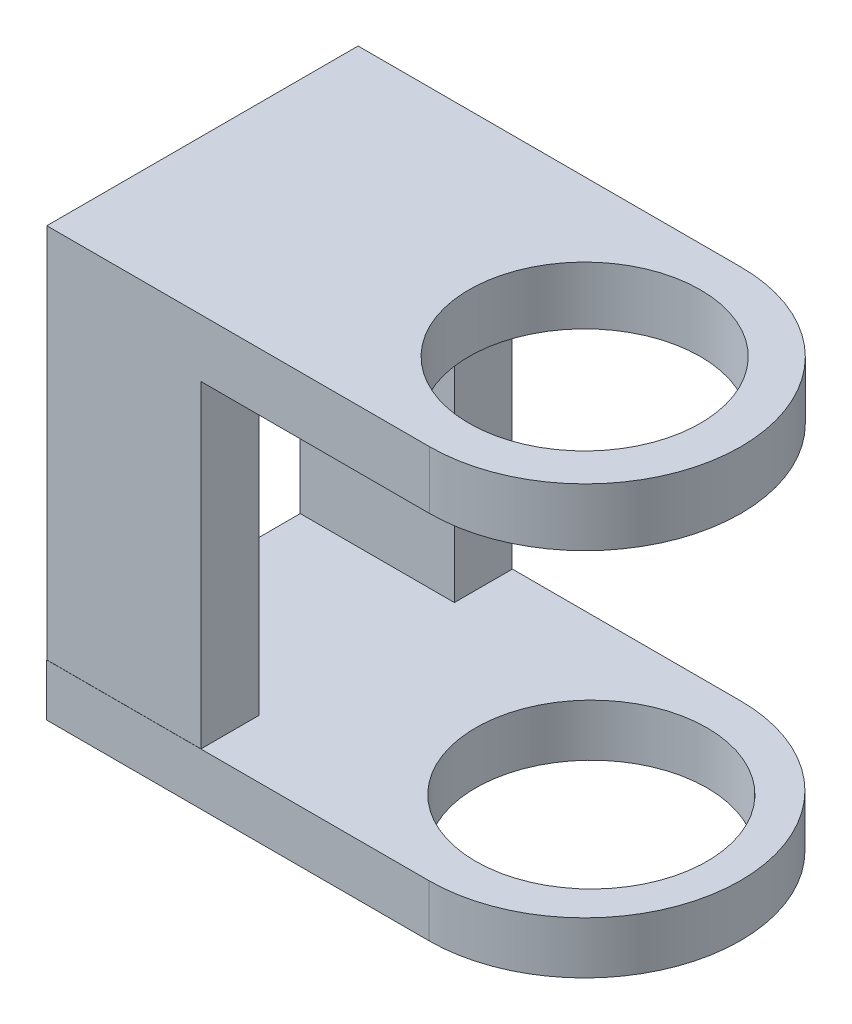
ISO-10303-21;
HEADER;
FILE_DESCRIPTION(('STEP AP214'),'2;1');
FILE_NAME('part.step','',(''),(''),'','','');
FILE_SCHEMA(('AUTOMOTIVE_DESIGN { 1 0 10303 214 1 1 1 1 }'));
ENDSEC;
DATA;
#1=APPLICATION_CONTEXT('core data for automotive mechanical design processes');
#2=APPLICATION_PROTOCOL_DEFINITION('international standard','automotive_design',2000,#1);
#3=PRODUCT_CONTEXT('',#1,'mechanical');
#4=PRODUCT('Part','Part','',(#3));
#5=PRODUCT_RELATED_PRODUCT_CATEGORY('part','',(#4));
#6=PRODUCT_DEFINITION_FORMATION('','',#4);
#7=PRODUCT_DEFINITION_CONTEXT('part definition',#1,'design');
#8=PRODUCT_DEFINITION('design','',#6,#7);
#9=PRODUCT_DEFINITION_SHAPE('','',#8);
#10=(LENGTH_UNIT() NAMED_UNIT(*) SI_UNIT(.MILLI.,.METRE.));
#11=(NAMED_UNIT(*) PLANE_ANGLE_UNIT() SI_UNIT($,.RADIAN.));
#12=(NAMED_UNIT(*) SI_UNIT($,.STERADIAN.) SOLID_ANGLE_UNIT());
#13=UNCERTAINTY_MEASURE_WITH_UNIT(LENGTH_MEASURE(1.E-05),#10,'distance_accuracy_value','');
#14=(GEOMETRIC_REPRESENTATION_CONTEXT(3) GLOBAL_UNCERTAINTY_ASSIGNED_CONTEXT((#13)) GLOBAL_UNIT_ASSIGNED_CONTEXT((#10,
#11,#12)) REPRESENTATION_CONTEXT('',''));
#15=CARTESIAN_POINT('',(0.,0.,0.));
#16=DIRECTION('',(0.,0.,1.));
#17=DIRECTION('',(1.,0.,0.));
#18=AXIS2_PLACEMENT_3D('',#15,#16,#17);
#19=CARTESIAN_POINT('',(0.,0.,0.));
#20=DIRECTION('',(0.,1.,0.));
#21=DIRECTION('',(0.,0.,1.));
#22=AXIS2_PLACEMENT_3D('',#19,#20,#21);
#23=PLANE('',#22);
#24=CARTESIAN_POINT('',(127.980340475688,0.,0.));
#25=DIRECTION('',(0.,1.,0.));
#26=DIRECTION('',(0.,0.,1.));
#27=AXIS2_PLACEMENT_3D('',#24,#25,#26);
#28=CIRCLE('',#27,20.);
#29=CARTESIAN_POINT('',(127.980340475688,0.,20.));
#30=VERTEX_POINT('',#29);
#31=EDGE_CURVE('E218',#30,#30,#28,.T.);
#32=ORIENTED_EDGE('',*,*,#31,.T.);
#33=EDGE_LOOP('',(#32));
#34=FACE_BOUND('',#33,.T.);
#35=DIRECTION('',(1.,0.,0.));
#36=VECTOR('',#35,1.);
#37=CARTESIAN_POINT('',(28.558456052823,0.,16.9042760508236));
#38=LINE('',#37,#36);
#39=CARTESIAN_POINT('',(61.9095747911587,0.,16.9042760508236));
#40=VERTEX_POINT('',#39);
#41=CARTESIAN_POINT('',(88.558456052823,0.,16.9042760508236));
#42=VERTEX_POINT('',#41);
#43=EDGE_CURVE('E185',#40,#42,#38,.T.);
#44=ORIENTED_EDGE('',*,*,#43,.F.);
#45=DIRECTION('',(0.,0.,-1.));
#46=VECTOR('',#45,1.);
#47=CARTESIAN_POINT('',(61.9095747911587,0.,0.));
#48=LINE('',#47,#46);
#49=CARTESIAN_POINT('',(61.9095747911587,0.,-16.9042760508236));
#50=VERTEX_POINT('',#49);
#51=EDGE_CURVE('E276',#40,#50,#48,.T.);
#52=ORIENTED_EDGE('',*,*,#51,.T.);
#53=DIRECTION('',(-1.,0.,0.));
#54=VECTOR('',#53,1.);
#55=CARTESIAN_POINT('',(28.558456052823,0.,-16.9042760508236));
#56=LINE('',#55,#54);
#57=CARTESIAN_POINT('',(88.558456052823,0.,-16.9042760508236));
#58=VERTEX_POINT('',#57);
#59=EDGE_CURVE('E171',#58,#50,#56,.T.);
#60=ORIENTED_EDGE('',*,*,#59,.F.);
#61=DIRECTION('',(0.,0.,1.));
#62=VECTOR('',#61,1.);
#63=CARTESIAN_POINT('',(88.558456052823,0.,-26.9042760508236));
#64=LINE('',#63,#62);
#65=CARTESIAN_POINT('',(88.558456052823,0.,-26.9042760508236));
#66=VERTEX_POINT('',#65);
#67=EDGE_CURVE('E167',#66,#58,#64,.T.);
#68=ORIENTED_EDGE('',*,*,#67,.F.);
#69=DIRECTION('',(-1.,0.,0.));
#70=VECTOR('',#69,1.);
#71=CARTESIAN_POINT('',(0.,0.,-26.9042760508236));
#72=LINE('',#71,#70);
#73=CARTESIAN_POINT('',(128.07951134054,0.,-26.9042760508236));
#74=VERTEX_POINT('',#73);
#75=EDGE_CURVE('E227',#74,#66,#72,.T.);
#76=ORIENTED_EDGE('',*,*,#75,.F.);
#77=CARTESIAN_POINT('',(128.07951134054,0.,0.));
#78=DIRECTION('',(0.,1.,0.));
#79=DIRECTION('',(0.,0.,1.));
#80=AXIS2_PLACEMENT_3D('',#77,#78,#79);
#81=CIRCLE('',#80,26.9042760508236);
#82=CARTESIAN_POINT('',(128.07951134054,0.,26.9042760508236));
#83=VERTEX_POINT('',#82);
#84=EDGE_CURVE('E234',#83,#74,#81,.T.);
#85=ORIENTED_EDGE('',*,*,#84,.F.);
#86=DIRECTION('',(1.,0.,0.));
#87=VECTOR('',#86,1.);
#88=CARTESIAN_POINT('',(0.,0.,26.9042760508236));
#89=LINE('',#88,#87);
#90=CARTESIAN_POINT('',(88.558456052823,0.,26.9042760508236));
#91=VERTEX_POINT('',#90);
#92=EDGE_CURVE('E205',#91,#83,#89,.T.);
#93=ORIENTED_EDGE('',*,*,#92,.F.);
#94=DIRECTION('',(0.,0.,1.));
#95=VECTOR('',#94,1.);
#96=CARTESIAN_POINT('',(88.558456052823,0.,26.9042760508236));
#97=LINE('',#96,#95);
#98=EDGE_CURVE('E189',#42,#91,#97,.T.);
#99=ORIENTED_EDGE('',*,*,#98,.F.);
#100=EDGE_LOOP('',(#44,#52,#60,#68,#76,#85,#93,#99));
#101=FACE_BOUND('',#100,.T.);
#102=ADVANCED_FACE('F33',(#34,#101),#23,.F.);
#103=CARTESIAN_POINT('',(0.,10.,26.9042760508236));
#104=DIRECTION('',(0.,0.,-1.));
#105=DIRECTION('',(-1.,0.,0.));
#106=AXIS2_PLACEMENT_3D('',#103,#104,#105);
#107=PLANE('',#106);
#108=DIRECTION('',(1.,0.,0.));
#109=VECTOR('',#108,1.);
#110=CARTESIAN_POINT('',(0.,10.,26.9042760508236));
#111=LINE('',#110,#109);
#112=CARTESIAN_POINT('',(61.9095747911587,10.,26.9042760508236));
#113=VERTEX_POINT('',#112);
#114=CARTESIAN_POINT('',(128.07951134054,10.,26.9042760508236));
#115=VERTEX_POINT('',#114);
#116=EDGE_CURVE('E224',#113,#115,#111,.T.);
#117=ORIENTED_EDGE('',*,*,#116,.F.);
#118=DIRECTION('',(0.,-1.,0.));
#119=VECTOR('',#118,1.);
#120=CARTESIAN_POINT('',(61.9095747911587,10.,26.9042760508236));
#121=LINE('',#120,#119);
#122=CARTESIAN_POINT('',(61.9095747911587,-55.,26.9042760508236));
#123=VERTEX_POINT('',#122);
#124=EDGE_CURVE('E267',#113,#123,#121,.T.);
#125=ORIENTED_EDGE('',*,*,#124,.T.);
#126=DIRECTION('',(-1.,0.,0.));
#127=VECTOR('',#126,1.);
#128=CARTESIAN_POINT('',(28.558456052823,-55.,26.9042760508236));
#129=LINE('',#128,#127);
#130=CARTESIAN_POINT('',(88.558456052823,-55.,26.9042760508236));
#131=VERTEX_POINT('',#130);
#132=EDGE_CURVE('E192',#131,#123,#129,.T.);
#133=ORIENTED_EDGE('',*,*,#132,.F.);
#134=DIRECTION('',(0.,1.,0.));
#135=VECTOR('',#134,1.);
#136=CARTESIAN_POINT('',(88.558456052823,-55.,26.9042760508236));
#137=LINE('',#136,#135);
#138=EDGE_CURVE('E195',#131,#91,#137,.T.);
#139=ORIENTED_EDGE('',*,*,#138,.T.);
#140=ORIENTED_EDGE('',*,*,#92,.T.);
#141=DIRECTION('',(0.,-1.,0.));
#142=VECTOR('',#141,1.);
#143=CARTESIAN_POINT('',(128.07951134054,10.,26.9042760508236));
#144=LINE('',#143,#142);
#145=EDGE_CURVE('E41',#115,#83,#144,.T.);
#146=ORIENTED_EDGE('',*,*,#145,.F.);
#147=EDGE_LOOP('',(#117,#125,#133,#139,#140,#146));
#148=FACE_BOUND('',#147,.T.);
#149=ADVANCED_FACE('F35',(#148),#107,.F.);
#150=CARTESIAN_POINT('',(128.07951134054,10.,0.));
#151=DIRECTION('',(0.,-1.,0.));
#152=DIRECTION('',(0.,0.,-1.));
#153=AXIS2_PLACEMENT_3D('',#150,#151,#152);
#154=CYLINDRICAL_SURFACE('',#153,26.9042760508236);
#155=ORIENTED_EDGE('',*,*,#84,.T.);
#156=DIRECTION('',(0.,-1.,0.));
#157=VECTOR('',#156,1.);
#158=CARTESIAN_POINT('',(128.07951134054,10.,-26.9042760508236));
#159=LINE('',#158,#157);
#160=CARTESIAN_POINT('',(128.07951134054,10.,-26.9042760508236));
#161=VERTEX_POINT('',#160);
#162=EDGE_CURVE('E231',#161,#74,#159,.T.);
#163=ORIENTED_EDGE('',*,*,#162,.F.);
#164=CARTESIAN_POINT('',(128.07951134054,10.,0.));
#165=DIRECTION('',(0.,1.,0.));
#166=DIRECTION('',(0.,0.,1.));
#167=AXIS2_PLACEMENT_3D('',#164,#165,#166);
#168=CIRCLE('',#167,26.9042760508236);
#169=EDGE_CURVE('E226',#115,#161,#168,.T.);
#170=ORIENTED_EDGE('',*,*,#169,.F.);
#171=ORIENTED_EDGE('',*,*,#145,.T.);
#172=EDGE_LOOP('',(#155,#163,#170,#171));
#173=FACE_BOUND('',#172,.T.);
#174=ADVANCED_FACE('F244',(#173),#154,.T.);
#175=CARTESIAN_POINT('',(0.,10.,-26.9042760508236));
#176=DIRECTION('',(0.,0.,1.));
#177=DIRECTION('',(1.,0.,0.));
#178=AXIS2_PLACEMENT_3D('',#175,#176,#177);
#179=PLANE('',#178);
#180=DIRECTION('',(1.,0.,0.));
#181=VECTOR('',#180,1.);
#182=CARTESIAN_POINT('',(28.558456052823,-55.,-26.9042760508236));
#183=LINE('',#182,#181);
#184=CARTESIAN_POINT('',(61.9095747911587,-55.,-26.9042760508236));
#185=VERTEX_POINT('',#184);
#186=CARTESIAN_POINT('',(88.558456052823,-55.,-26.9042760508236));
#187=VERTEX_POINT('',#186);
#188=EDGE_CURVE('E168',#185,#187,#183,.T.);
#189=ORIENTED_EDGE('',*,*,#188,.F.);
#190=DIRECTION('',(0.,1.,0.));
#191=VECTOR('',#190,1.);
#192=CARTESIAN_POINT('',(61.9095747911587,10.,-26.9042760508236));
#193=LINE('',#192,#191);
#194=CARTESIAN_POINT('',(61.9095747911587,10.,-26.9042760508236));
#195=VERTEX_POINT('',#194);
#196=EDGE_CURVE('E260',#185,#195,#193,.T.);
#197=ORIENTED_EDGE('',*,*,#196,.T.);
#198=DIRECTION('',(-1.,0.,0.));
#199=VECTOR('',#198,1.);
#200=CARTESIAN_POINT('',(0.,10.,-26.9042760508236));
#201=LINE('',#200,#199);
#202=EDGE_CURVE('E229',#161,#195,#201,.T.);
#203=ORIENTED_EDGE('',*,*,#202,.F.);
#204=ORIENTED_EDGE('',*,*,#162,.T.);
#205=ORIENTED_EDGE('',*,*,#75,.T.);
#206=DIRECTION('',(0.,1.,0.));
#207=VECTOR('',#206,1.);
#208=CARTESIAN_POINT('',(88.558456052823,-55.,-26.9042760508236));
#209=LINE('',#208,#207);
#210=EDGE_CURVE('E183',#187,#66,#209,.T.);
#211=ORIENTED_EDGE('',*,*,#210,.F.);
#212=EDGE_LOOP('',(#189,#197,#203,#204,#205,#211));
#213=FACE_BOUND('',#212,.T.);
#214=ADVANCED_FACE('F256',(#213),#179,.F.);
#215=CARTESIAN_POINT('',(0.,10.,0.));
#216=DIRECTION('',(0.,1.,0.));
#217=DIRECTION('',(0.,0.,1.));
#218=AXIS2_PLACEMENT_3D('',#215,#216,#217);
#219=PLANE('',#218);
#220=DIRECTION('',(0.,0.,-1.));
#221=VECTOR('',#220,1.);
#222=CARTESIAN_POINT('',(61.9095747911587,10.,0.));
#223=LINE('',#222,#221);
#224=EDGE_CURVE('E265',#113,#195,#223,.T.);
#225=ORIENTED_EDGE('',*,*,#224,.F.);
#226=ORIENTED_EDGE('',*,*,#116,.T.);
#227=ORIENTED_EDGE('',*,*,#169,.T.);
#228=ORIENTED_EDGE('',*,*,#202,.T.);
#229=EDGE_LOOP('',(#225,#226,#227,#228));
#230=FACE_BOUND('',#229,.T.);
#231=CARTESIAN_POINT('',(127.980340475688,10.,0.));
#232=DIRECTION('',(0.,1.,0.));
#233=DIRECTION('',(0.,0.,1.));
#234=AXIS2_PLACEMENT_3D('',#231,#232,#233);
#235=CIRCLE('',#234,20.);
#236=CARTESIAN_POINT('',(127.980340475688,10.,20.));
#237=VERTEX_POINT('',#236);
#238=EDGE_CURVE('E213',#237,#237,#235,.T.);
#239=ORIENTED_EDGE('',*,*,#238,.F.);
#240=EDGE_LOOP('',(#239));
#241=FACE_BOUND('',#240,.T.);
#242=ADVANCED_FACE('F263',(#230,#241),#219,.T.);
#243=CARTESIAN_POINT('',(127.980340475688,0.,0.));
#244=DIRECTION('',(0.,1.,0.));
#245=DIRECTION('',(0.,0.,1.));
#246=AXIS2_PLACEMENT_3D('',#243,#244,#245);
#247=CYLINDRICAL_SURFACE('',#246,20.);
#248=ORIENTED_EDGE('',*,*,#31,.F.);
#249=EDGE_LOOP('',(#248));
#250=FACE_BOUND('',#249,.T.);
#251=ORIENTED_EDGE('',*,*,#238,.T.);
#252=EDGE_LOOP('',(#251));
#253=FACE_BOUND('',#252,.T.);
#254=ADVANCED_FACE('F340',(#250,#253),#247,.F.);
#255=CARTESIAN_POINT('',(28.558456052823,-55.,16.9042760508236));
#256=DIRECTION('',(0.,0.,1.));
#257=DIRECTION('',(1.,0.,0.));
#258=AXIS2_PLACEMENT_3D('',#255,#256,#257);
#259=PLANE('',#258);
#260=DIRECTION('',(1.,0.,0.));
#261=VECTOR('',#260,1.);
#262=CARTESIAN_POINT('',(28.558456052823,-55.,16.9042760508236));
#263=LINE('',#262,#261);
#264=CARTESIAN_POINT('',(61.9095747911587,-55.,16.9042760508236));
#265=VERTEX_POINT('',#264);
#266=CARTESIAN_POINT('',(88.558456052823,-55.,16.9042760508236));
#267=VERTEX_POINT('',#266);
#268=EDGE_CURVE('E186',#265,#267,#263,.T.);
#269=ORIENTED_EDGE('',*,*,#268,.F.);
#270=DIRECTION('',(0.,1.,0.));
#271=VECTOR('',#270,1.);
#272=CARTESIAN_POINT('',(61.9095747911587,-55.,16.9042760508236));
#273=LINE('',#272,#271);
#274=EDGE_CURVE('E48',#265,#40,#273,.T.);
#275=ORIENTED_EDGE('',*,*,#274,.T.);
#276=ORIENTED_EDGE('',*,*,#43,.T.);
#277=DIRECTION('',(0.,1.,0.));
#278=VECTOR('',#277,1.);
#279=CARTESIAN_POINT('',(88.558456052823,-55.,16.9042760508236));
#280=LINE('',#279,#278);
#281=EDGE_CURVE('E199',#267,#42,#280,.T.);
#282=ORIENTED_EDGE('',*,*,#281,.F.);
#283=EDGE_LOOP('',(#269,#275,#276,#282));
#284=FACE_BOUND('',#283,.T.);
#285=ADVANCED_FACE('F278',(#284),#259,.F.);
#286=CARTESIAN_POINT('',(88.558456052823,-55.,26.9042760508236));
#287=DIRECTION('',(-1.,0.,0.));
#288=DIRECTION('',(0.,0.,1.));
#289=AXIS2_PLACEMENT_3D('',#286,#287,#288);
#290=PLANE('',#289);
#291=ORIENTED_EDGE('',*,*,#98,.T.);
#292=ORIENTED_EDGE('',*,*,#138,.F.);
#293=DIRECTION('',(0.,0.,1.));
#294=VECTOR('',#293,1.);
#295=CARTESIAN_POINT('',(88.558456052823,-55.,26.9042760508236));
#296=LINE('',#295,#294);
#297=EDGE_CURVE('E188',#267,#131,#296,.T.);
#298=ORIENTED_EDGE('',*,*,#297,.F.);
#299=ORIENTED_EDGE('',*,*,#281,.T.);
#300=EDGE_LOOP('',(#291,#292,#298,#299));
#301=FACE_BOUND('',#300,.T.);
#302=ADVANCED_FACE('F274',(#301),#290,.F.);
#303=CARTESIAN_POINT('',(88.558456052823,-55.,-26.9042760508236));
#304=DIRECTION('',(-1.,0.,0.));
#305=DIRECTION('',(0.,0.,1.));
#306=AXIS2_PLACEMENT_3D('',#303,#304,#305);
#307=PLANE('',#306);
#308=ORIENTED_EDGE('',*,*,#67,.T.);
#309=DIRECTION('',(0.,1.,0.));
#310=VECTOR('',#309,1.);
#311=CARTESIAN_POINT('',(88.558456052823,-55.,-16.9042760508236));
#312=LINE('',#311,#310);
#313=CARTESIAN_POINT('',(88.558456052823,-55.,-16.9042760508236));
#314=VERTEX_POINT('',#313);
#315=EDGE_CURVE('E177',#314,#58,#312,.T.);
#316=ORIENTED_EDGE('',*,*,#315,.F.);
#317=DIRECTION('',(0.,0.,1.));
#318=VECTOR('',#317,1.);
#319=CARTESIAN_POINT('',(88.558456052823,-55.,-26.9042760508236));
#320=LINE('',#319,#318);
#321=EDGE_CURVE('E170',#187,#314,#320,.T.);
#322=ORIENTED_EDGE('',*,*,#321,.F.);
#323=ORIENTED_EDGE('',*,*,#210,.T.);
#324=EDGE_LOOP('',(#308,#316,#322,#323));
#325=FACE_BOUND('',#324,.T.);
#326=ADVANCED_FACE('F305',(#325),#307,.F.);
#327=CARTESIAN_POINT('',(28.558456052823,-55.,-16.9042760508236));
#328=DIRECTION('',(0.,0.,-1.));
#329=DIRECTION('',(-1.,0.,0.));
#330=AXIS2_PLACEMENT_3D('',#327,#328,#329);
#331=PLANE('',#330);
#332=ORIENTED_EDGE('',*,*,#59,.T.);
#333=DIRECTION('',(0.,-1.,0.));
#334=VECTOR('',#333,1.);
#335=CARTESIAN_POINT('',(61.9095747911587,-55.,-16.9042760508236));
#336=LINE('',#335,#334);
#337=CARTESIAN_POINT('',(61.9095747911587,-55.,-16.9042760508236));
#338=VERTEX_POINT('',#337);
#339=EDGE_CURVE('E279',#50,#338,#336,.T.);
#340=ORIENTED_EDGE('',*,*,#339,.T.);
#341=DIRECTION('',(-1.,0.,0.));
#342=VECTOR('',#341,1.);
#343=CARTESIAN_POINT('',(28.558456052823,-55.,-16.9042760508236));
#344=LINE('',#343,#342);
#345=EDGE_CURVE('E174',#314,#338,#344,.T.);
#346=ORIENTED_EDGE('',*,*,#345,.F.);
#347=ORIENTED_EDGE('',*,*,#315,.T.);
#348=EDGE_LOOP('',(#332,#340,#346,#347));
#349=FACE_BOUND('',#348,.T.);
#350=ADVANCED_FACE('F303',(#349),#331,.F.);
#351=CARTESIAN_POINT('',(0.,-55.,0.));
#352=DIRECTION('',(0.,-1.,0.));
#353=DIRECTION('',(0.,0.,-1.));
#354=AXIS2_PLACEMENT_3D('',#351,#352,#353);
#355=PLANE('',#354);
#356=CARTESIAN_POINT('',(129.13998933297,-55.,0.));
#357=DIRECTION('',(0.,-1.,0.));
#358=DIRECTION('',(0.,0.,-1.));
#359=AXIS2_PLACEMENT_3D('',#356,#357,#358);
#360=CIRCLE('',#359,20.);
#361=CARTESIAN_POINT('',(129.13998933297,-55.,-20.));
#362=VERTEX_POINT('',#361);
#363=EDGE_CURVE('E162',#362,#362,#360,.T.);
#364=ORIENTED_EDGE('',*,*,#363,.T.);
#365=EDGE_LOOP('',(#364));
#366=FACE_BOUND('',#365,.T.);
#367=DIRECTION('',(1.,0.,0.));
#368=VECTOR('',#367,1.);
#369=CARTESIAN_POINT('',(0.,-55.,-26.9297733026264));
#370=LINE('',#369,#368);
#371=CARTESIAN_POINT('',(61.9095747911587,-55.,-26.9297733026264));
#372=VERTEX_POINT('',#371);
#373=CARTESIAN_POINT('',(127.980340475688,-55.,-26.9297733026264));
#374=VERTEX_POINT('',#373);
#375=EDGE_CURVE('E159',#372,#374,#370,.T.);
#376=ORIENTED_EDGE('',*,*,#375,.F.);
#377=DIRECTION('',(0.,0.,1.));
#378=VECTOR('',#377,1.);
#379=CARTESIAN_POINT('',(61.9095747911587,-55.,0.));
#380=LINE('',#379,#378);
#381=EDGE_CURVE('E297',#372,#185,#380,.T.);
#382=ORIENTED_EDGE('',*,*,#381,.T.);
#383=ORIENTED_EDGE('',*,*,#188,.T.);
#384=ORIENTED_EDGE('',*,*,#321,.T.);
#385=ORIENTED_EDGE('',*,*,#345,.T.);
#386=EDGE_CURVE('E284',#338,#265,#380,.T.);
#387=ORIENTED_EDGE('',*,*,#386,.T.);
#388=ORIENTED_EDGE('',*,*,#268,.T.);
#389=ORIENTED_EDGE('',*,*,#297,.T.);
#390=ORIENTED_EDGE('',*,*,#132,.T.);
#391=CARTESIAN_POINT('',(61.9095747911587,-55.,26.9297733026264));
#392=VERTEX_POINT('',#391);
#393=EDGE_CURVE('E268',#123,#392,#380,.T.);
#394=ORIENTED_EDGE('',*,*,#393,.T.);
#395=DIRECTION('',(-1.,0.,0.));
#396=VECTOR('',#395,1.);
#397=CARTESIAN_POINT('',(0.,-55.,26.9297733026264));
#398=LINE('',#397,#396);
#399=CARTESIAN_POINT('',(127.980340475688,-55.,26.9297733026264));
#400=VERTEX_POINT('',#399);
#401=EDGE_CURVE('E144',#400,#392,#398,.T.);
#402=ORIENTED_EDGE('',*,*,#401,.F.);
#403=CARTESIAN_POINT('',(127.980340475688,-55.,0.));
#404=DIRECTION('',(0.,-1.,0.));
#405=DIRECTION('',(0.,0.,-1.));
#406=AXIS2_PLACEMENT_3D('',#403,#404,#405);
#407=CIRCLE('',#406,26.9297733026264);
#408=EDGE_CURVE('E161',#374,#400,#407,.T.);
#409=ORIENTED_EDGE('',*,*,#408,.F.);
#410=EDGE_LOOP('',(#376,#382,#383,#384,#385,#387,#388,#389,#390,#394,#402,#409));
#411=FACE_BOUND('',#410,.T.);
#412=ADVANCED_FACE('F272',(#366,#411),#355,.F.);
#413=CARTESIAN_POINT('',(0.,-64.,-26.9297733026264));
#414=DIRECTION('',(0.,0.,1.));
#415=DIRECTION('',(1.,0.,0.));
#416=AXIS2_PLACEMENT_3D('',#413,#414,#415);
#417=PLANE('',#416);
#418=DIRECTION('',(1.,0.,0.));
#419=VECTOR('',#418,1.);
#420=CARTESIAN_POINT('',(0.,-64.,-26.9297733026264));
#421=LINE('',#420,#419);
#422=CARTESIAN_POINT('',(61.9095747911587,-64.,-26.9297733026264));
#423=VERTEX_POINT('',#422);
#424=CARTESIAN_POINT('',(127.980340475688,-64.,-26.9297733026264));
#425=VERTEX_POINT('',#424);
#426=EDGE_CURVE('E155',#423,#425,#421,.T.);
#427=ORIENTED_EDGE('',*,*,#426,.F.);
#428=DIRECTION('',(0.,1.,0.));
#429=VECTOR('',#428,1.);
#430=CARTESIAN_POINT('',(61.9095747911587,-64.,-26.9297733026264));
#431=LINE('',#430,#429);
#432=EDGE_CURVE('E55',#423,#372,#431,.T.);
#433=ORIENTED_EDGE('',*,*,#432,.T.);
#434=ORIENTED_EDGE('',*,*,#375,.T.);
#435=DIRECTION('',(0.,1.,0.));
#436=VECTOR('',#435,1.);
#437=CARTESIAN_POINT('',(127.980340475688,-64.,-26.9297733026264));
#438=LINE('',#437,#436);
#439=EDGE_CURVE('E153',#425,#374,#438,.T.);
#440=ORIENTED_EDGE('',*,*,#439,.F.);
#441=EDGE_LOOP('',(#427,#433,#434,#440));
#442=FACE_BOUND('',#441,.T.);
#443=ADVANCED_FACE('F292',(#442),#417,.F.);
#444=CARTESIAN_POINT('',(127.980340475688,-64.,0.));
#445=DIRECTION('',(0.,1.,0.));
#446=DIRECTION('',(0.,0.,1.));
#447=AXIS2_PLACEMENT_3D('',#444,#445,#446);
#448=CYLINDRICAL_SURFACE('',#447,26.9297733026264);
#449=ORIENTED_EDGE('',*,*,#408,.T.);
#450=DIRECTION('',(0.,1.,0.));
#451=VECTOR('',#450,1.);
#452=CARTESIAN_POINT('',(127.980340475688,-64.,26.9297733026264));
#453=LINE('',#452,#451);
#454=CARTESIAN_POINT('',(127.980340475688,-64.,26.9297733026264));
#455=VERTEX_POINT('',#454);
#456=EDGE_CURVE('E151',#455,#400,#453,.T.);
#457=ORIENTED_EDGE('',*,*,#456,.F.);
#458=CARTESIAN_POINT('',(127.980340475688,-64.,0.));
#459=DIRECTION('',(0.,-1.,0.));
#460=DIRECTION('',(0.,0.,-1.));
#461=AXIS2_PLACEMENT_3D('',#458,#459,#460);
#462=CIRCLE('',#461,26.9297733026264);
#463=EDGE_CURVE('E149',#425,#455,#462,.T.);
#464=ORIENTED_EDGE('',*,*,#463,.F.);
#465=ORIENTED_EDGE('',*,*,#439,.T.);
#466=EDGE_LOOP('',(#449,#457,#464,#465));
#467=FACE_BOUND('',#466,.T.);
#468=ADVANCED_FACE('F295',(#467),#448,.T.);
#469=CARTESIAN_POINT('',(0.,-64.,26.9297733026264));
#470=DIRECTION('',(0.,0.,-1.));
#471=DIRECTION('',(-1.,0.,0.));
#472=AXIS2_PLACEMENT_3D('',#469,#470,#471);
#473=PLANE('',#472);
#474=ORIENTED_EDGE('',*,*,#401,.T.);
#475=DIRECTION('',(0.,1.,0.));
#476=VECTOR('',#475,1.);
#477=CARTESIAN_POINT('',(61.9095747911587,29.4863490076338,26.9297733026264));
#478=LINE('',#477,#476);
#479=CARTESIAN_POINT('',(61.9095747911587,-64.,26.9297733026264));
#480=VERTEX_POINT('',#479);
#481=EDGE_CURVE('E132',#480,#392,#478,.T.);
#482=ORIENTED_EDGE('',*,*,#481,.F.);
#483=DIRECTION('',(-1.,0.,0.));
#484=VECTOR('',#483,1.);
#485=CARTESIAN_POINT('',(0.,-64.,26.9297733026264));
#486=LINE('',#485,#484);
#487=EDGE_CURVE('E142',#455,#480,#486,.T.);
#488=ORIENTED_EDGE('',*,*,#487,.F.);
#489=ORIENTED_EDGE('',*,*,#456,.T.);
#490=EDGE_LOOP('',(#474,#482,#488,#489));
#491=FACE_BOUND('',#490,.T.);
#492=ADVANCED_FACE('F140',(#491),#473,.F.);
#493=CARTESIAN_POINT('',(0.,-64.,0.));
#494=DIRECTION('',(0.,-1.,0.));
#495=DIRECTION('',(0.,0.,-1.));
#496=AXIS2_PLACEMENT_3D('',#493,#494,#495);
#497=PLANE('',#496);
#498=DIRECTION('',(0.,0.,1.));
#499=VECTOR('',#498,1.);
#500=CARTESIAN_POINT('',(61.9095747911587,-64.,0.));
#501=LINE('',#500,#499);
#502=EDGE_CURVE('E11',#423,#480,#501,.T.);
#503=ORIENTED_EDGE('',*,*,#502,.F.);
#504=ORIENTED_EDGE('',*,*,#426,.T.);
#505=ORIENTED_EDGE('',*,*,#463,.T.);
#506=ORIENTED_EDGE('',*,*,#487,.T.);
#507=EDGE_LOOP('',(#503,#504,#505,#506));
#508=FACE_BOUND('',#507,.T.);
#509=CARTESIAN_POINT('',(129.13998933297,-64.,0.));
#510=DIRECTION('',(0.,-1.,0.));
#511=DIRECTION('',(0.,0.,-1.));
#512=AXIS2_PLACEMENT_3D('',#509,#510,#511);
#513=CIRCLE('',#512,20.);
#514=CARTESIAN_POINT('',(129.13998933297,-64.,-20.));
#515=VERTEX_POINT('',#514);
#516=EDGE_CURVE('E281',#515,#515,#513,.T.);
#517=ORIENTED_EDGE('',*,*,#516,.F.);
#518=EDGE_LOOP('',(#517));
#519=FACE_BOUND('',#518,.T.);
#520=ADVANCED_FACE('F146',(#508,#519),#497,.T.);
#521=CARTESIAN_POINT('',(129.13998933297,-55.,0.));
#522=DIRECTION('',(0.,-1.,0.));
#523=DIRECTION('',(0.,0.,-1.));
#524=AXIS2_PLACEMENT_3D('',#521,#522,#523);
#525=CYLINDRICAL_SURFACE('',#524,20.);
#526=ORIENTED_EDGE('',*,*,#363,.F.);
#527=EDGE_LOOP('',(#526));
#528=FACE_BOUND('',#527,.T.);
#529=ORIENTED_EDGE('',*,*,#516,.T.);
#530=EDGE_LOOP('',(#529));
#531=FACE_BOUND('',#530,.T.);
#532=ADVANCED_FACE('F378',(#528,#531),#525,.F.);
#533=CARTESIAN_POINT('',(61.9095747911587,29.4863490076338,-27.0702266973736));
#534=DIRECTION('',(1.,0.,0.));
#535=DIRECTION('',(0.,0.,-1.));
#536=AXIS2_PLACEMENT_3D('',#533,#534,#535);
#537=PLANE('',#536);
#538=ORIENTED_EDGE('',*,*,#124,.F.);
#539=ORIENTED_EDGE('',*,*,#224,.T.);
#540=ORIENTED_EDGE('',*,*,#196,.F.);
#541=ORIENTED_EDGE('',*,*,#381,.F.);
#542=ORIENTED_EDGE('',*,*,#432,.F.);
#543=ORIENTED_EDGE('',*,*,#502,.T.);
#544=ORIENTED_EDGE('',*,*,#481,.T.);
#545=ORIENTED_EDGE('',*,*,#393,.F.);
#546=EDGE_LOOP('',(#538,#539,#540,#541,#542,#543,#544,#545));
#547=FACE_BOUND('',#546,.T.);
#548=ORIENTED_EDGE('',*,*,#274,.F.);
#549=ORIENTED_EDGE('',*,*,#386,.F.);
#550=ORIENTED_EDGE('',*,*,#339,.F.);
#551=ORIENTED_EDGE('',*,*,#51,.F.);
#552=EDGE_LOOP('',(#548,#549,#550,#551));
#553=FACE_BOUND('',#552,.T.);
#554=ADVANCED_FACE('F131',(#547,#553),#537,.F.);
#555=CLOSED_SHELL('',(#102,#149,#174,#214,#242,#254,#285,#302,#326,#350,#412,#443,#468,#492,
#520,#532,#554));
#556=MANIFOLD_SOLID_BREP('B2',#555);
#557=ADVANCED_BREP_SHAPE_REPRESENTATION('',(#18,#556),#14);
#558=SHAPE_DEFINITION_REPRESENTATION(#9,#557);
ENDSEC;
END-ISO-10303-21;
